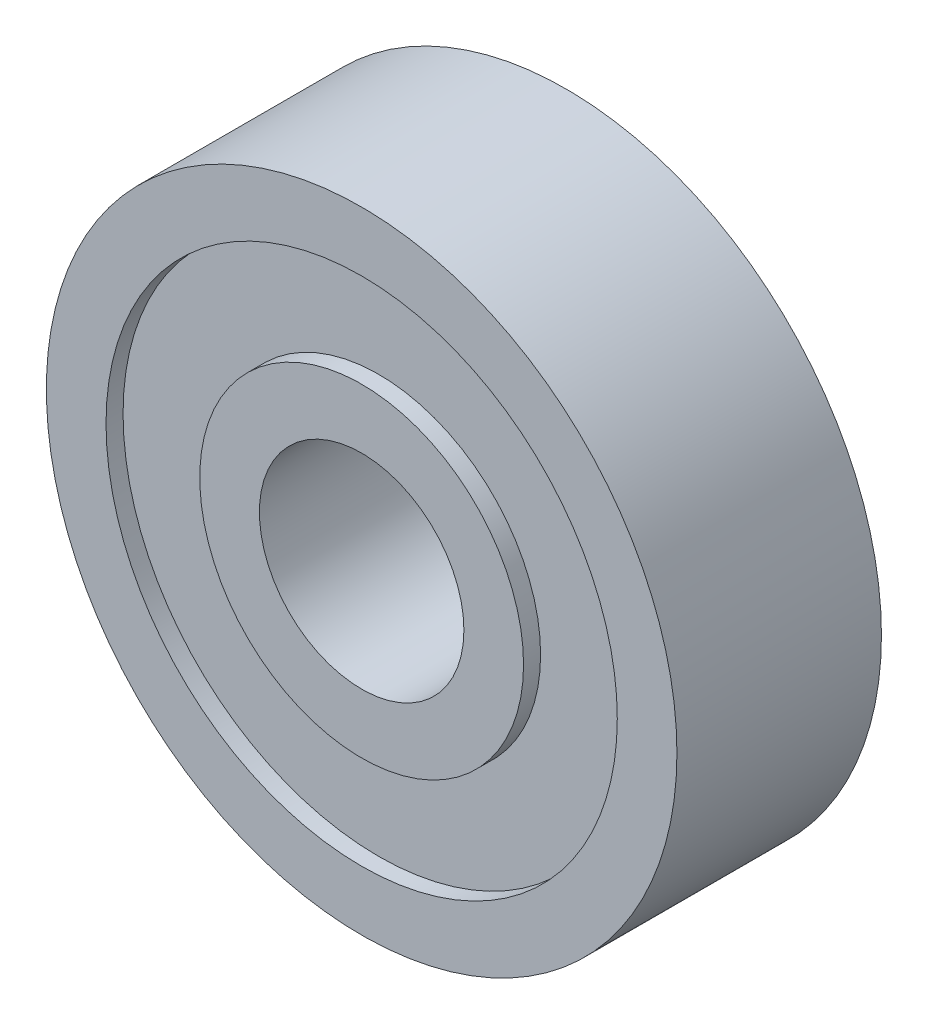
ISO-10303-21;
HEADER;
FILE_DESCRIPTION(('STEP AP214'),'2;1');
FILE_NAME('part.step','',(''),(''),'','','');
FILE_SCHEMA(('AUTOMOTIVE_DESIGN { 1 0 10303 214 1 1 1 1 }'));
ENDSEC;
DATA;
#1=APPLICATION_CONTEXT('core data for automotive mechanical design processes');
#2=APPLICATION_PROTOCOL_DEFINITION('international standard','automotive_design',2000,#1);
#3=PRODUCT_CONTEXT('',#1,'mechanical');
#4=PRODUCT('Part','Part','',(#3));
#5=PRODUCT_RELATED_PRODUCT_CATEGORY('part','',(#4));
#6=PRODUCT_DEFINITION_FORMATION('','',#4);
#7=PRODUCT_DEFINITION_CONTEXT('part definition',#1,'design');
#8=PRODUCT_DEFINITION('design','',#6,#7);
#9=PRODUCT_DEFINITION_SHAPE('','',#8);
#10=(LENGTH_UNIT() NAMED_UNIT(*) SI_UNIT(.MILLI.,.METRE.));
#11=(NAMED_UNIT(*) PLANE_ANGLE_UNIT() SI_UNIT($,.RADIAN.));
#12=(NAMED_UNIT(*) SI_UNIT($,.STERADIAN.) SOLID_ANGLE_UNIT());
#13=UNCERTAINTY_MEASURE_WITH_UNIT(LENGTH_MEASURE(1.E-05),#10,'distance_accuracy_value','');
#14=(GEOMETRIC_REPRESENTATION_CONTEXT(3) GLOBAL_UNCERTAINTY_ASSIGNED_CONTEXT((#13)) GLOBAL_UNIT_ASSIGNED_CONTEXT((#10,
#11,#12)) REPRESENTATION_CONTEXT('',''));
#15=CARTESIAN_POINT('',(0.,0.,0.));
#16=DIRECTION('',(0.,0.,1.));
#17=DIRECTION('',(1.,0.,0.));
#18=AXIS2_PLACEMENT_3D('',#15,#16,#17);
#19=CARTESIAN_POINT('',(0.,0.,0.));
#20=DIRECTION('',(0.,0.,1.));
#21=DIRECTION('',(1.,0.,0.));
#22=AXIS2_PLACEMENT_3D('',#19,#20,#21);
#23=PLANE('',#22);
#24=CARTESIAN_POINT('',(0.,0.,0.));
#25=DIRECTION('',(0.,0.,1.));
#26=DIRECTION('',(1.,0.,0.));
#27=AXIS2_PLACEMENT_3D('',#24,#25,#26);
#28=CIRCLE('',#27,6.);
#29=CARTESIAN_POINT('',(6.,0.,0.));
#30=VERTEX_POINT('',#29);
#31=EDGE_CURVE('E42',#30,#30,#28,.T.);
#32=ORIENTED_EDGE('',*,*,#31,.T.);
#33=EDGE_LOOP('',(#32));
#34=FACE_BOUND('',#33,.T.);
#35=CARTESIAN_POINT('',(0.,0.,0.));
#36=DIRECTION('',(0.,0.,-1.));
#37=DIRECTION('',(-1.,0.,0.));
#38=AXIS2_PLACEMENT_3D('',#35,#36,#37);
#39=CIRCLE('',#38,9.5);
#40=CARTESIAN_POINT('',(-9.5,0.,0.));
#41=VERTEX_POINT('',#40);
#42=EDGE_CURVE('E68',#41,#41,#39,.T.);
#43=ORIENTED_EDGE('',*,*,#42,.T.);
#44=EDGE_LOOP('',(#43));
#45=FACE_BOUND('',#44,.T.);
#46=ADVANCED_FACE('F31',(#34,#45),#23,.F.);
#47=CARTESIAN_POINT('',(0.,0.,12.));
#48=DIRECTION('',(0.,0.,1.));
#49=DIRECTION('',(1.,0.,0.));
#50=AXIS2_PLACEMENT_3D('',#47,#48,#49);
#51=PLANE('',#50);
#52=CARTESIAN_POINT('',(0.,0.,12.));
#53=DIRECTION('',(0.,0.,1.));
#54=DIRECTION('',(1.,0.,0.));
#55=AXIS2_PLACEMENT_3D('',#52,#53,#54);
#56=CIRCLE('',#55,6.);
#57=CARTESIAN_POINT('',(6.,0.,12.));
#58=VERTEX_POINT('',#57);
#59=EDGE_CURVE('E44',#58,#58,#56,.T.);
#60=ORIENTED_EDGE('',*,*,#59,.F.);
#61=EDGE_LOOP('',(#60));
#62=FACE_BOUND('',#61,.T.);
#63=CARTESIAN_POINT('',(0.,0.,12.));
#64=DIRECTION('',(0.,0.,1.));
#65=DIRECTION('',(1.,0.,0.));
#66=AXIS2_PLACEMENT_3D('',#63,#64,#65);
#67=CIRCLE('',#66,9.5);
#68=CARTESIAN_POINT('',(9.5,0.,12.));
#69=VERTEX_POINT('',#68);
#70=EDGE_CURVE('E56',#69,#69,#67,.T.);
#71=ORIENTED_EDGE('',*,*,#70,.T.);
#72=EDGE_LOOP('',(#71));
#73=FACE_BOUND('',#72,.T.);
#74=ADVANCED_FACE('F98',(#62,#73),#51,.T.);
#75=CARTESIAN_POINT('',(0.,0.,12.));
#76=DIRECTION('',(0.,0.,-1.));
#77=DIRECTION('',(-1.,0.,0.));
#78=AXIS2_PLACEMENT_3D('',#75,#76,#77);
#79=CYLINDRICAL_SURFACE('',#78,18.5);
#80=CARTESIAN_POINT('',(0.,0.,12.));
#81=DIRECTION('',(0.,0.,1.));
#82=DIRECTION('',(1.,0.,0.));
#83=AXIS2_PLACEMENT_3D('',#80,#81,#82);
#84=CIRCLE('',#83,18.5);
#85=CARTESIAN_POINT('',(18.5,0.,12.));
#86=VERTEX_POINT('',#85);
#87=EDGE_CURVE('E10',#86,#86,#84,.T.);
#88=ORIENTED_EDGE('',*,*,#87,.F.);
#89=EDGE_LOOP('',(#88));
#90=FACE_BOUND('',#89,.T.);
#91=CARTESIAN_POINT('',(0.,0.,0.));
#92=DIRECTION('',(0.,0.,1.));
#93=DIRECTION('',(1.,0.,0.));
#94=AXIS2_PLACEMENT_3D('',#91,#92,#93);
#95=CIRCLE('',#94,18.5);
#96=CARTESIAN_POINT('',(18.5,0.,0.));
#97=VERTEX_POINT('',#96);
#98=EDGE_CURVE('E35',#97,#97,#95,.T.);
#99=ORIENTED_EDGE('',*,*,#98,.T.);
#100=EDGE_LOOP('',(#99));
#101=FACE_BOUND('',#100,.T.);
#102=ADVANCED_FACE('F33',(#90,#101),#79,.T.);
#103=CARTESIAN_POINT('',(0.,0.,12.));
#104=DIRECTION('',(0.,0.,1.));
#105=DIRECTION('',(1.,0.,0.));
#106=AXIS2_PLACEMENT_3D('',#103,#104,#105);
#107=CIRCLE('',#106,15.);
#108=CARTESIAN_POINT('',(15.,0.,12.));
#109=VERTEX_POINT('',#108);
#110=EDGE_CURVE('E50',#109,#109,#107,.T.);
#111=ORIENTED_EDGE('',*,*,#110,.F.);
#112=EDGE_LOOP('',(#111));
#113=FACE_BOUND('',#112,.T.);
#114=ORIENTED_EDGE('',*,*,#87,.T.);
#115=EDGE_LOOP('',(#114));
#116=FACE_BOUND('',#115,.T.);
#117=ADVANCED_FACE('F94',(#113,#116),#51,.T.);
#118=CARTESIAN_POINT('',(0.,0.,0.));
#119=DIRECTION('',(0.,0.,-1.));
#120=DIRECTION('',(-1.,0.,0.));
#121=AXIS2_PLACEMENT_3D('',#118,#119,#120);
#122=CIRCLE('',#121,15.);
#123=CARTESIAN_POINT('',(-15.,0.,0.));
#124=VERTEX_POINT('',#123);
#125=EDGE_CURVE('E62',#124,#124,#122,.T.);
#126=ORIENTED_EDGE('',*,*,#125,.F.);
#127=EDGE_LOOP('',(#126));
#128=FACE_BOUND('',#127,.T.);
#129=ORIENTED_EDGE('',*,*,#98,.F.);
#130=EDGE_LOOP('',(#129));
#131=FACE_BOUND('',#130,.T.);
#132=ADVANCED_FACE('F90',(#128,#131),#23,.F.);
#133=CARTESIAN_POINT('',(0.,0.,0.));
#134=DIRECTION('',(0.,0.,1.));
#135=DIRECTION('',(1.,0.,0.));
#136=AXIS2_PLACEMENT_3D('',#133,#134,#135);
#137=CYLINDRICAL_SURFACE('',#136,6.);
#138=ORIENTED_EDGE('',*,*,#31,.F.);
#139=EDGE_LOOP('',(#138));
#140=FACE_BOUND('',#139,.T.);
#141=ORIENTED_EDGE('',*,*,#59,.T.);
#142=EDGE_LOOP('',(#141));
#143=FACE_BOUND('',#142,.T.);
#144=ADVANCED_FACE('F93',(#140,#143),#137,.F.);
#145=CARTESIAN_POINT('',(0.,0.,11.));
#146=DIRECTION('',(0.,0.,1.));
#147=DIRECTION('',(1.,0.,0.));
#148=AXIS2_PLACEMENT_3D('',#145,#146,#147);
#149=CYLINDRICAL_SURFACE('',#148,15.);
#150=CARTESIAN_POINT('',(0.,0.,11.));
#151=DIRECTION('',(0.,0.,1.));
#152=DIRECTION('',(1.,0.,0.));
#153=AXIS2_PLACEMENT_3D('',#150,#151,#152);
#154=CIRCLE('',#153,15.);
#155=CARTESIAN_POINT('',(15.,0.,11.));
#156=VERTEX_POINT('',#155);
#157=EDGE_CURVE('E47',#156,#156,#154,.T.);
#158=ORIENTED_EDGE('',*,*,#157,.F.);
#159=EDGE_LOOP('',(#158));
#160=FACE_BOUND('',#159,.T.);
#161=ORIENTED_EDGE('',*,*,#110,.T.);
#162=EDGE_LOOP('',(#161));
#163=FACE_BOUND('',#162,.T.);
#164=ADVANCED_FACE('F115',(#160,#163),#149,.F.);
#165=CARTESIAN_POINT('',(0.,0.,11.));
#166=DIRECTION('',(0.,0.,1.));
#167=DIRECTION('',(1.,0.,0.));
#168=AXIS2_PLACEMENT_3D('',#165,#166,#167);
#169=PLANE('',#168);
#170=CARTESIAN_POINT('',(0.,0.,11.));
#171=DIRECTION('',(0.,0.,1.));
#172=DIRECTION('',(1.,0.,0.));
#173=AXIS2_PLACEMENT_3D('',#170,#171,#172);
#174=CIRCLE('',#173,9.5);
#175=CARTESIAN_POINT('',(9.5,0.,11.));
#176=VERTEX_POINT('',#175);
#177=EDGE_CURVE('E53',#176,#176,#174,.T.);
#178=ORIENTED_EDGE('',*,*,#177,.F.);
#179=EDGE_LOOP('',(#178));
#180=FACE_BOUND('',#179,.T.);
#181=ORIENTED_EDGE('',*,*,#157,.T.);
#182=EDGE_LOOP('',(#181));
#183=FACE_BOUND('',#182,.T.);
#184=ADVANCED_FACE('F119',(#180,#183),#169,.T.);
#185=CARTESIAN_POINT('',(0.,0.,11.));
#186=DIRECTION('',(0.,0.,1.));
#187=DIRECTION('',(1.,0.,0.));
#188=AXIS2_PLACEMENT_3D('',#185,#186,#187);
#189=CYLINDRICAL_SURFACE('',#188,9.5);
#190=ORIENTED_EDGE('',*,*,#177,.T.);
#191=EDGE_LOOP('',(#190));
#192=FACE_BOUND('',#191,.T.);
#193=ORIENTED_EDGE('',*,*,#70,.F.);
#194=EDGE_LOOP('',(#193));
#195=FACE_BOUND('',#194,.T.);
#196=ADVANCED_FACE('F86',(#192,#195),#189,.T.);
#197=CARTESIAN_POINT('',(0.,0.,1.));
#198=DIRECTION('',(0.,0.,-1.));
#199=DIRECTION('',(-1.,0.,0.));
#200=AXIS2_PLACEMENT_3D('',#197,#198,#199);
#201=CYLINDRICAL_SURFACE('',#200,15.);
#202=CARTESIAN_POINT('',(0.,0.,1.));
#203=DIRECTION('',(0.,0.,-1.));
#204=DIRECTION('',(-1.,0.,0.));
#205=AXIS2_PLACEMENT_3D('',#202,#203,#204);
#206=CIRCLE('',#205,15.);
#207=CARTESIAN_POINT('',(-15.,0.,1.));
#208=VERTEX_POINT('',#207);
#209=EDGE_CURVE('E59',#208,#208,#206,.T.);
#210=ORIENTED_EDGE('',*,*,#209,.F.);
#211=EDGE_LOOP('',(#210));
#212=FACE_BOUND('',#211,.T.);
#213=ORIENTED_EDGE('',*,*,#125,.T.);
#214=EDGE_LOOP('',(#213));
#215=FACE_BOUND('',#214,.T.);
#216=ADVANCED_FACE('F80',(#212,#215),#201,.F.);
#217=CARTESIAN_POINT('',(0.,0.,1.));
#218=DIRECTION('',(0.,0.,-1.));
#219=DIRECTION('',(-1.,0.,0.));
#220=AXIS2_PLACEMENT_3D('',#217,#218,#219);
#221=PLANE('',#220);
#222=CARTESIAN_POINT('',(0.,0.,1.));
#223=DIRECTION('',(0.,0.,-1.));
#224=DIRECTION('',(-1.,0.,0.));
#225=AXIS2_PLACEMENT_3D('',#222,#223,#224);
#226=CIRCLE('',#225,9.5);
#227=CARTESIAN_POINT('',(-9.5,0.,1.));
#228=VERTEX_POINT('',#227);
#229=EDGE_CURVE('E65',#228,#228,#226,.T.);
#230=ORIENTED_EDGE('',*,*,#229,.F.);
#231=EDGE_LOOP('',(#230));
#232=FACE_BOUND('',#231,.T.);
#233=ORIENTED_EDGE('',*,*,#209,.T.);
#234=EDGE_LOOP('',(#233));
#235=FACE_BOUND('',#234,.T.);
#236=ADVANCED_FACE('F77',(#232,#235),#221,.T.);
#237=CARTESIAN_POINT('',(0.,0.,1.));
#238=DIRECTION('',(0.,0.,-1.));
#239=DIRECTION('',(-1.,0.,0.));
#240=AXIS2_PLACEMENT_3D('',#237,#238,#239);
#241=CYLINDRICAL_SURFACE('',#240,9.5);
#242=ORIENTED_EDGE('',*,*,#229,.T.);
#243=EDGE_LOOP('',(#242));
#244=FACE_BOUND('',#243,.T.);
#245=ORIENTED_EDGE('',*,*,#42,.F.);
#246=EDGE_LOOP('',(#245));
#247=FACE_BOUND('',#246,.T.);
#248=ADVANCED_FACE('F74',(#244,#247),#241,.T.);
#249=CLOSED_SHELL('',(#46,#74,#102,#117,#132,#144,#164,#184,#196,#216,#236,#248));
#250=MANIFOLD_SOLID_BREP('B2',#249);
#251=ADVANCED_BREP_SHAPE_REPRESENTATION('',(#18,#250),#14);
#252=SHAPE_DEFINITION_REPRESENTATION(#9,#251);
ENDSEC;
END-ISO-10303-21;
